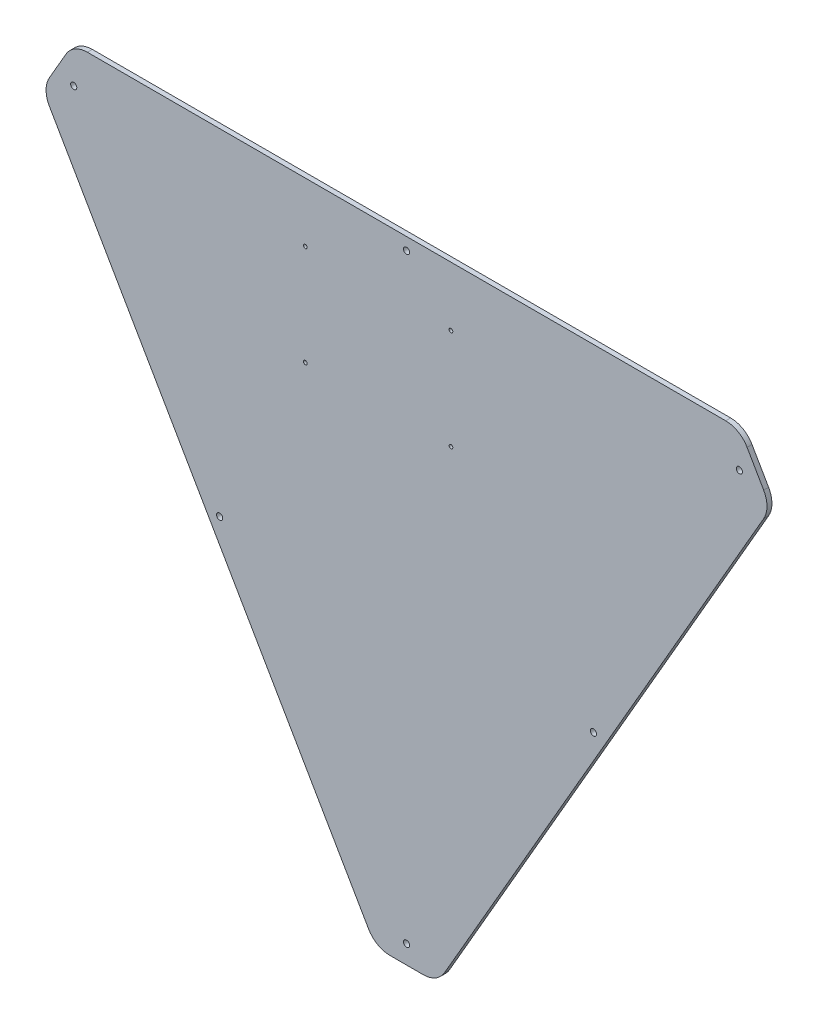
ISO-10303-21;
HEADER;
FILE_DESCRIPTION(('STEP AP214'),'2;1');
FILE_NAME('part.step','',(''),(''),'','','');
FILE_SCHEMA(('AUTOMOTIVE_DESIGN { 1 0 10303 214 1 1 1 1 }'));
ENDSEC;
DATA;
#1=APPLICATION_CONTEXT('core data for automotive mechanical design processes');
#2=APPLICATION_PROTOCOL_DEFINITION('international standard','automotive_design',2000,#1);
#3=PRODUCT_CONTEXT('',#1,'mechanical');
#4=PRODUCT('Part','Part','',(#3));
#5=PRODUCT_RELATED_PRODUCT_CATEGORY('part','',(#4));
#6=PRODUCT_DEFINITION_FORMATION('','',#4);
#7=PRODUCT_DEFINITION_CONTEXT('part definition',#1,'design');
#8=PRODUCT_DEFINITION('design','',#6,#7);
#9=PRODUCT_DEFINITION_SHAPE('','',#8);
#10=(LENGTH_UNIT() NAMED_UNIT(*) SI_UNIT(.MILLI.,.METRE.));
#11=(NAMED_UNIT(*) PLANE_ANGLE_UNIT() SI_UNIT($,.RADIAN.));
#12=(NAMED_UNIT(*) SI_UNIT($,.STERADIAN.) SOLID_ANGLE_UNIT());
#13=UNCERTAINTY_MEASURE_WITH_UNIT(LENGTH_MEASURE(1.E-05),#10,'distance_accuracy_value','');
#14=(GEOMETRIC_REPRESENTATION_CONTEXT(3) GLOBAL_UNCERTAINTY_ASSIGNED_CONTEXT((#13)) GLOBAL_UNIT_ASSIGNED_CONTEXT((#10,
#11,#12)) REPRESENTATION_CONTEXT('',''));
#15=CARTESIAN_POINT('',(0.,0.,0.));
#16=DIRECTION('',(0.,0.,1.));
#17=DIRECTION('',(1.,0.,0.));
#18=AXIS2_PLACEMENT_3D('',#15,#16,#17);
#19=CARTESIAN_POINT('',(306.552641702223,193.342371016313,4.));
#20=DIRECTION('',(0.,0.,1.));
#21=DIRECTION('',(1.,0.,0.));
#22=AXIS2_PLACEMENT_3D('',#19,#20,#21);
#23=PLANE('',#22);
#24=CARTESIAN_POINT('',(70.4393930481637,107.143641205548,4.));
#25=DIRECTION('',(0.,0.,1.));
#26=DIRECTION('',(1.,0.,0.));
#27=AXIS2_PLACEMENT_3D('',#24,#25,#26);
#28=CIRCLE('',#27,1.5);
#29=CARTESIAN_POINT('',(71.9393930481637,107.143641205548,4.));
#30=VERTEX_POINT('',#29);
#31=EDGE_CURVE('E301',#30,#30,#28,.T.);
#32=ORIENTED_EDGE('',*,*,#31,.F.);
#33=EDGE_LOOP('',(#32));
#34=FACE_BOUND('',#33,.T.);
#35=CARTESIAN_POINT('',(-47.5606069518363,188.643641205548,4.));
#36=DIRECTION('',(0.,0.,1.));
#37=DIRECTION('',(-1.,0.,0.));
#38=AXIS2_PLACEMENT_3D('',#35,#36,#37);
#39=CIRCLE('',#38,1.5);
#40=CARTESIAN_POINT('',(-49.0606069518363,188.643641205548,4.));
#41=VERTEX_POINT('',#40);
#42=EDGE_CURVE('E295',#41,#41,#39,.T.);
#43=ORIENTED_EDGE('',*,*,#42,.F.);
#44=EDGE_LOOP('',(#43));
#45=FACE_BOUND('',#44,.T.);
#46=CARTESIAN_POINT('',(70.4393930481637,188.643641205548,4.));
#47=DIRECTION('',(0.,0.,1.));
#48=DIRECTION('',(-1.,0.,0.));
#49=AXIS2_PLACEMENT_3D('',#46,#47,#48);
#50=CIRCLE('',#49,1.5);
#51=CARTESIAN_POINT('',(68.9393930481637,188.643641205548,4.));
#52=VERTEX_POINT('',#51);
#53=EDGE_CURVE('E289',#52,#52,#50,.T.);
#54=ORIENTED_EDGE('',*,*,#53,.F.);
#55=EDGE_LOOP('',(#54));
#56=FACE_BOUND('',#55,.T.);
#57=CARTESIAN_POINT('',(-47.5606069518363,107.143641205548,4.));
#58=DIRECTION('',(0.,0.,1.));
#59=DIRECTION('',(1.,0.,0.));
#60=AXIS2_PLACEMENT_3D('',#57,#58,#59);
#61=CIRCLE('',#60,1.5);
#62=CARTESIAN_POINT('',(-46.0606069518363,107.143641205548,4.));
#63=VERTEX_POINT('',#62);
#64=EDGE_CURVE('E283',#63,#63,#61,.T.);
#65=ORIENTED_EDGE('',*,*,#64,.F.);
#66=EDGE_LOOP('',(#65));
#67=FACE_BOUND('',#66,.T.);
#68=CARTESIAN_POINT('',(-235.277485316707,207.493006110937,4.));
#69=DIRECTION('',(0.,0.,1.));
#70=DIRECTION('',(1.,0.,0.));
#71=AXIS2_PLACEMENT_3D('',#68,#69,#70);
#72=CIRCLE('',#71,2.5);
#73=CARTESIAN_POINT('',(-232.777485316707,207.493006110937,4.));
#74=VERTEX_POINT('',#73);
#75=EDGE_CURVE('E278',#74,#74,#72,.T.);
#76=ORIENTED_EDGE('',*,*,#75,.F.);
#77=EDGE_LOOP('',(#76));
#78=FACE_BOUND('',#77,.T.);
#79=CARTESIAN_POINT('',(304.156271413035,207.493006110921,4.));
#80=DIRECTION('',(0.,0.,1.));
#81=DIRECTION('',(1.,0.,0.));
#82=AXIS2_PLACEMENT_3D('',#79,#80,#81);
#83=CIRCLE('',#82,2.50000000000002);
#84=CARTESIAN_POINT('',(306.656271413035,207.493006110921,4.));
#85=VERTEX_POINT('',#84);
#86=EDGE_CURVE('E272',#85,#85,#83,.T.);
#87=ORIENTED_EDGE('',*,*,#86,.F.);
#88=EDGE_LOOP('',(#87));
#89=FACE_BOUND('',#88,.T.);
#90=CARTESIAN_POINT('',(34.4393930481654,-259.67033087591,4.));
#91=DIRECTION('',(0.,0.,1.));
#92=DIRECTION('',(1.,0.,0.));
#93=AXIS2_PLACEMENT_3D('',#90,#91,#92);
#94=CIRCLE('',#93,2.5);
#95=CARTESIAN_POINT('',(36.9393930481654,-259.67033087591,4.));
#96=VERTEX_POINT('',#95);
#97=EDGE_CURVE('E266',#96,#96,#94,.T.);
#98=ORIENTED_EDGE('',*,*,#97,.F.);
#99=EDGE_LOOP('',(#98));
#100=FACE_BOUND('',#99,.T.);
#101=CARTESIAN_POINT('',(185.882768721146,-35.6639799297911,4.));
#102=DIRECTION('',(0.,0.,1.));
#103=DIRECTION('',(1.,0.,0.));
#104=AXIS2_PLACEMENT_3D('',#101,#102,#103);
#105=CIRCLE('',#104,2.5);
#106=CARTESIAN_POINT('',(188.382768721146,-35.6639799297911,4.));
#107=VERTEX_POINT('',#106);
#108=EDGE_CURVE('E260',#107,#107,#105,.T.);
#109=ORIENTED_EDGE('',*,*,#108,.F.);
#110=EDGE_LOOP('',(#109));
#111=FACE_BOUND('',#110,.T.);
#112=CARTESIAN_POINT('',(-117.003982624812,-35.6639799297933,4.));
#113=DIRECTION('',(0.,0.,1.));
#114=DIRECTION('',(1.,0.,0.));
#115=AXIS2_PLACEMENT_3D('',#112,#113,#114);
#116=CIRCLE('',#115,2.5);
#117=CARTESIAN_POINT('',(-114.503982624812,-35.6639799297933,4.));
#118=VERTEX_POINT('',#117);
#119=EDGE_CURVE('E253',#118,#118,#116,.T.);
#120=ORIENTED_EDGE('',*,*,#119,.F.);
#121=EDGE_LOOP('',(#120));
#122=FACE_BOUND('',#121,.T.);
#123=CARTESIAN_POINT('',(34.439393048171,226.643641205547,4.));
#124=DIRECTION('',(0.,0.,1.));
#125=DIRECTION('',(1.,0.,0.));
#126=AXIS2_PLACEMENT_3D('',#123,#124,#125);
#127=CIRCLE('',#126,2.49999999999314);
#128=CARTESIAN_POINT('',(36.9393930481641,226.643641205547,4.));
#129=VERTEX_POINT('',#128);
#130=EDGE_CURVE('E247',#129,#129,#127,.T.);
#131=ORIENTED_EDGE('',*,*,#130,.F.);
#132=EDGE_LOOP('',(#131));
#133=FACE_BOUND('',#132,.T.);
#134=DIRECTION('',(0.5,0.866025403784439,0.));
#135=VECTOR('',#134,1.);
#136=CARTESIAN_POINT('',(69.5430227589896,-257.170330875906,4.));
#137=LINE('',#136,#135);
#138=CARTESIAN_POINT('',(65.2128957400673,-264.670330875907,4.));
#139=VERTEX_POINT('',#138);
#140=CARTESIAN_POINT('',(323.873149777912,183.342371016313,4.));
#141=VERTEX_POINT('',#140);
#142=EDGE_CURVE('E50',#139,#141,#137,.T.);
#143=ORIENTED_EDGE('',*,*,#142,.T.);
#144=CARTESIAN_POINT('',(306.552641702223,193.342371016313,4.));
#145=DIRECTION('',(0.,0.,1.));
#146=DIRECTION('',(1.,0.,0.));
#147=AXIS2_PLACEMENT_3D('',#144,#145,#146);
#148=CIRCLE('',#147,20.);
#149=CARTESIAN_POINT('',(323.873149777905,203.342371016326,4.));
#150=VERTEX_POINT('',#149);
#151=EDGE_CURVE('E243',#141,#150,#148,.T.);
#152=ORIENTED_EDGE('',*,*,#151,.T.);
#153=DIRECTION('',(-0.500000000000001,0.866025403784438,0.));
#154=VECTOR('',#153,1.);
#155=CARTESIAN_POINT('',(310.420155161697,226.643641205548,4.));
#156=LINE('',#155,#154);
#157=CARTESIAN_POINT('',(310.420155161697,226.643641205548,4.));
#158=VERTEX_POINT('',#157);
#159=EDGE_CURVE('E204',#150,#158,#156,.T.);
#160=ORIENTED_EDGE('',*,*,#159,.T.);
#161=CARTESIAN_POINT('',(293.099647086009,216.643641205547,4.));
#162=DIRECTION('',(0.,0.,1.));
#163=DIRECTION('',(1.,0.,0.));
#164=AXIS2_PLACEMENT_3D('',#161,#162,#163);
#165=CIRCLE('',#164,20.);
#166=CARTESIAN_POINT('',(293.099647086009,236.643641205547,4.));
#167=VERTEX_POINT('',#166);
#168=EDGE_CURVE('E224',#158,#167,#165,.T.);
#169=ORIENTED_EDGE('',*,*,#168,.T.);
#170=DIRECTION('',(-1.,0.,0.));
#171=VECTOR('',#170,1.);
#172=CARTESIAN_POINT('',(284.439393048164,236.643641205547,4.));
#173=LINE('',#172,#171);
#174=CARTESIAN_POINT('',(-224.220860989681,236.643641205548,4.));
#175=VERTEX_POINT('',#174);
#176=EDGE_CURVE('E221',#167,#175,#173,.T.);
#177=ORIENTED_EDGE('',*,*,#176,.T.);
#178=CARTESIAN_POINT('',(-224.220860989681,216.643641205548,4.));
#179=DIRECTION('',(0.,0.,1.));
#180=DIRECTION('',(1.,0.,0.));
#181=AXIS2_PLACEMENT_3D('',#178,#179,#180);
#182=CIRCLE('',#181,20.);
#183=CARTESIAN_POINT('',(-241.54136906537,226.643641205547,4.));
#184=VERTEX_POINT('',#183);
#185=EDGE_CURVE('E223',#175,#184,#182,.T.);
#186=ORIENTED_EDGE('',*,*,#185,.T.);
#187=DIRECTION('',(-0.499999999999993,-0.866025403784443,0.));
#188=VECTOR('',#187,1.);
#189=CARTESIAN_POINT('',(-254.994363681577,203.342371016325,4.));
#190=LINE('',#189,#188);
#191=CARTESIAN_POINT('',(-254.994363681577,203.342371016325,4.));
#192=VERTEX_POINT('',#191);
#193=EDGE_CURVE('E226',#184,#192,#190,.T.);
#194=ORIENTED_EDGE('',*,*,#193,.T.);
#195=CARTESIAN_POINT('',(-237.673855605888,193.342371016326,4.));
#196=DIRECTION('',(0.,0.,1.));
#197=DIRECTION('',(1.,0.,0.));
#198=AXIS2_PLACEMENT_3D('',#195,#196,#197);
#199=CIRCLE('',#198,20.);
#200=CARTESIAN_POINT('',(-254.994363681577,183.342371016325,4.));
#201=VERTEX_POINT('',#200);
#202=EDGE_CURVE('E232',#192,#201,#199,.T.);
#203=ORIENTED_EDGE('',*,*,#202,.T.);
#204=DIRECTION('',(0.500000000000013,-0.866025403784431,0.));
#205=VECTOR('',#204,1.);
#206=CARTESIAN_POINT('',(-250.664236662655,175.842371016325,4.));
#207=LINE('',#206,#205);
#208=CARTESIAN_POINT('',(3.66589035627478,-264.670330875907,4.));
#209=VERTEX_POINT('',#208);
#210=EDGE_CURVE('E133',#201,#209,#207,.T.);
#211=ORIENTED_EDGE('',*,*,#210,.T.);
#212=CARTESIAN_POINT('',(20.9863984319636,-254.670330875907,4.));
#213=DIRECTION('',(0.,0.,1.));
#214=DIRECTION('',(1.,0.,0.));
#215=AXIS2_PLACEMENT_3D('',#212,#213,#214);
#216=CIRCLE('',#215,20.);
#217=CARTESIAN_POINT('',(20.9863984319636,-274.670330875907,4.));
#218=VERTEX_POINT('',#217);
#219=EDGE_CURVE('E128',#209,#218,#216,.T.);
#220=ORIENTED_EDGE('',*,*,#219,.T.);
#221=DIRECTION('',(1.,0.,0.));
#222=VECTOR('',#221,1.);
#223=CARTESIAN_POINT('',(47.8923876643785,-274.670330875907,4.));
#224=LINE('',#223,#222);
#225=CARTESIAN_POINT('',(47.8923876643785,-274.670330875907,4.));
#226=VERTEX_POINT('',#225);
#227=EDGE_CURVE('E131',#218,#226,#224,.T.);
#228=ORIENTED_EDGE('',*,*,#227,.T.);
#229=CARTESIAN_POINT('',(47.8923876643785,-254.670330875907,4.));
#230=DIRECTION('',(0.,0.,1.));
#231=DIRECTION('',(1.,0.,0.));
#232=AXIS2_PLACEMENT_3D('',#229,#230,#231);
#233=CIRCLE('',#232,20.);
#234=EDGE_CURVE('E147',#226,#139,#233,.T.);
#235=ORIENTED_EDGE('',*,*,#234,.T.);
#236=EDGE_LOOP('',(#143,#152,#160,#169,#177,#186,#194,#203,#211,#220,#228,#235));
#237=FACE_BOUND('',#236,.T.);
#238=ADVANCED_FACE('F33',(#34,#45,#56,#67,#78,#89,#100,#111,#122,#133,#237),#23,.T.);
#239=CARTESIAN_POINT('',(306.552641702223,193.342371016313,0.));
#240=DIRECTION('',(0.,0.,1.));
#241=DIRECTION('',(1.,0.,0.));
#242=AXIS2_PLACEMENT_3D('',#239,#240,#241);
#243=PLANE('',#242);
#244=CARTESIAN_POINT('',(70.4393930481637,107.143641205548,0.));
#245=DIRECTION('',(0.,0.,1.));
#246=DIRECTION('',(1.,0.,0.));
#247=AXIS2_PLACEMENT_3D('',#244,#245,#246);
#248=CIRCLE('',#247,1.5);
#249=CARTESIAN_POINT('',(71.9393930481637,107.143641205548,0.));
#250=VERTEX_POINT('',#249);
#251=EDGE_CURVE('E286',#250,#250,#248,.T.);
#252=ORIENTED_EDGE('',*,*,#251,.T.);
#253=EDGE_LOOP('',(#252));
#254=FACE_BOUND('',#253,.T.);
#255=CARTESIAN_POINT('',(-47.5606069518363,188.643641205548,0.));
#256=DIRECTION('',(0.,0.,1.));
#257=DIRECTION('',(-1.,0.,0.));
#258=AXIS2_PLACEMENT_3D('',#255,#256,#257);
#259=CIRCLE('',#258,1.5);
#260=CARTESIAN_POINT('',(-49.0606069518363,188.643641205548,0.));
#261=VERTEX_POINT('',#260);
#262=EDGE_CURVE('E298',#261,#261,#259,.T.);
#263=ORIENTED_EDGE('',*,*,#262,.T.);
#264=EDGE_LOOP('',(#263));
#265=FACE_BOUND('',#264,.T.);
#266=CARTESIAN_POINT('',(70.4393930481637,188.643641205548,0.));
#267=DIRECTION('',(0.,0.,1.));
#268=DIRECTION('',(-1.,0.,0.));
#269=AXIS2_PLACEMENT_3D('',#266,#267,#268);
#270=CIRCLE('',#269,1.5);
#271=CARTESIAN_POINT('',(68.9393930481637,188.643641205548,0.));
#272=VERTEX_POINT('',#271);
#273=EDGE_CURVE('E292',#272,#272,#270,.T.);
#274=ORIENTED_EDGE('',*,*,#273,.T.);
#275=EDGE_LOOP('',(#274));
#276=FACE_BOUND('',#275,.T.);
#277=CARTESIAN_POINT('',(-47.5606069518363,107.143641205548,0.));
#278=DIRECTION('',(0.,0.,1.));
#279=DIRECTION('',(1.,0.,0.));
#280=AXIS2_PLACEMENT_3D('',#277,#278,#279);
#281=CIRCLE('',#280,1.5);
#282=CARTESIAN_POINT('',(-46.0606069518363,107.143641205548,0.));
#283=VERTEX_POINT('',#282);
#284=EDGE_CURVE('E257',#283,#283,#281,.T.);
#285=ORIENTED_EDGE('',*,*,#284,.T.);
#286=EDGE_LOOP('',(#285));
#287=FACE_BOUND('',#286,.T.);
#288=CARTESIAN_POINT('',(-235.277485316707,207.493006110937,0.));
#289=DIRECTION('',(0.,0.,1.));
#290=DIRECTION('',(1.,0.,0.));
#291=AXIS2_PLACEMENT_3D('',#288,#289,#290);
#292=CIRCLE('',#291,2.5);
#293=CARTESIAN_POINT('',(-232.777485316707,207.493006110937,0.));
#294=VERTEX_POINT('',#293);
#295=EDGE_CURVE('E250',#294,#294,#292,.T.);
#296=ORIENTED_EDGE('',*,*,#295,.T.);
#297=EDGE_LOOP('',(#296));
#298=FACE_BOUND('',#297,.T.);
#299=CARTESIAN_POINT('',(304.156271413035,207.493006110921,0.));
#300=DIRECTION('',(0.,0.,1.));
#301=DIRECTION('',(1.,0.,0.));
#302=AXIS2_PLACEMENT_3D('',#299,#300,#301);
#303=CIRCLE('',#302,2.50000000000002);
#304=CARTESIAN_POINT('',(306.656271413035,207.493006110921,0.));
#305=VERTEX_POINT('',#304);
#306=EDGE_CURVE('E275',#305,#305,#303,.T.);
#307=ORIENTED_EDGE('',*,*,#306,.T.);
#308=EDGE_LOOP('',(#307));
#309=FACE_BOUND('',#308,.T.);
#310=CARTESIAN_POINT('',(34.4393930481654,-259.67033087591,0.));
#311=DIRECTION('',(0.,0.,1.));
#312=DIRECTION('',(1.,0.,0.));
#313=AXIS2_PLACEMENT_3D('',#310,#311,#312);
#314=CIRCLE('',#313,2.5);
#315=CARTESIAN_POINT('',(36.9393930481654,-259.67033087591,0.));
#316=VERTEX_POINT('',#315);
#317=EDGE_CURVE('E269',#316,#316,#314,.T.);
#318=ORIENTED_EDGE('',*,*,#317,.T.);
#319=EDGE_LOOP('',(#318));
#320=FACE_BOUND('',#319,.T.);
#321=CARTESIAN_POINT('',(185.882768721146,-35.6639799297911,0.));
#322=DIRECTION('',(0.,0.,1.));
#323=DIRECTION('',(1.,0.,0.));
#324=AXIS2_PLACEMENT_3D('',#321,#322,#323);
#325=CIRCLE('',#324,2.5);
#326=CARTESIAN_POINT('',(188.382768721146,-35.6639799297911,0.));
#327=VERTEX_POINT('',#326);
#328=EDGE_CURVE('E263',#327,#327,#325,.T.);
#329=ORIENTED_EDGE('',*,*,#328,.T.);
#330=EDGE_LOOP('',(#329));
#331=FACE_BOUND('',#330,.T.);
#332=CARTESIAN_POINT('',(-117.003982624812,-35.6639799297933,0.));
#333=DIRECTION('',(0.,0.,1.));
#334=DIRECTION('',(1.,0.,0.));
#335=AXIS2_PLACEMENT_3D('',#332,#333,#334);
#336=CIRCLE('',#335,2.5);
#337=CARTESIAN_POINT('',(-114.503982624812,-35.6639799297933,0.));
#338=VERTEX_POINT('',#337);
#339=EDGE_CURVE('E256',#338,#338,#336,.T.);
#340=ORIENTED_EDGE('',*,*,#339,.T.);
#341=EDGE_LOOP('',(#340));
#342=FACE_BOUND('',#341,.T.);
#343=CARTESIAN_POINT('',(34.439393048171,226.643641205547,0.));
#344=DIRECTION('',(0.,0.,1.));
#345=DIRECTION('',(1.,0.,0.));
#346=AXIS2_PLACEMENT_3D('',#343,#344,#345);
#347=CIRCLE('',#346,2.49999999999314);
#348=CARTESIAN_POINT('',(36.9393930481641,226.643641205547,0.));
#349=VERTEX_POINT('',#348);
#350=EDGE_CURVE('E156',#349,#349,#347,.T.);
#351=ORIENTED_EDGE('',*,*,#350,.T.);
#352=EDGE_LOOP('',(#351));
#353=FACE_BOUND('',#352,.T.);
#354=CARTESIAN_POINT('',(306.552641702223,193.342371016313,0.));
#355=DIRECTION('',(0.,0.,1.));
#356=DIRECTION('',(1.,0.,0.));
#357=AXIS2_PLACEMENT_3D('',#354,#355,#356);
#358=CIRCLE('',#357,20.);
#359=CARTESIAN_POINT('',(323.873149777912,183.342371016313,0.));
#360=VERTEX_POINT('',#359);
#361=CARTESIAN_POINT('',(323.873149777905,203.342371016326,0.));
#362=VERTEX_POINT('',#361);
#363=EDGE_CURVE('E153',#360,#362,#358,.T.);
#364=ORIENTED_EDGE('',*,*,#363,.F.);
#365=DIRECTION('',(0.499999999999999,0.866025403784439,0.));
#366=VECTOR('',#365,1.);
#367=CARTESIAN_POINT('',(69.5430227589896,-257.170330875906,0.));
#368=LINE('',#367,#366);
#369=CARTESIAN_POINT('',(65.2128957400673,-264.670330875907,0.));
#370=VERTEX_POINT('',#369);
#371=EDGE_CURVE('E175',#370,#360,#368,.T.);
#372=ORIENTED_EDGE('',*,*,#371,.F.);
#373=CARTESIAN_POINT('',(47.8923876643785,-254.670330875907,0.));
#374=DIRECTION('',(0.,0.,1.));
#375=DIRECTION('',(1.,0.,0.));
#376=AXIS2_PLACEMENT_3D('',#373,#374,#375);
#377=CIRCLE('',#376,20.);
#378=CARTESIAN_POINT('',(47.8923876643785,-274.670330875907,0.));
#379=VERTEX_POINT('',#378);
#380=EDGE_CURVE('E99',#379,#370,#377,.T.);
#381=ORIENTED_EDGE('',*,*,#380,.F.);
#382=DIRECTION('',(1.,0.,0.));
#383=VECTOR('',#382,1.);
#384=CARTESIAN_POINT('',(47.8923876643785,-274.670330875907,0.));
#385=LINE('',#384,#383);
#386=CARTESIAN_POINT('',(20.9863984319636,-274.670330875907,0.));
#387=VERTEX_POINT('',#386);
#388=EDGE_CURVE('E92',#387,#379,#385,.T.);
#389=ORIENTED_EDGE('',*,*,#388,.F.);
#390=CARTESIAN_POINT('',(20.9863984319636,-254.670330875907,0.));
#391=DIRECTION('',(0.,0.,1.));
#392=DIRECTION('',(1.,0.,0.));
#393=AXIS2_PLACEMENT_3D('',#390,#391,#392);
#394=CIRCLE('',#393,20.);
#395=CARTESIAN_POINT('',(3.66589035627478,-264.670330875907,0.));
#396=VERTEX_POINT('',#395);
#397=EDGE_CURVE('E141',#396,#387,#394,.T.);
#398=ORIENTED_EDGE('',*,*,#397,.F.);
#399=DIRECTION('',(0.500000000000644,-0.866025403784067,0.));
#400=VECTOR('',#399,1.);
#401=CARTESIAN_POINT('',(3.66589035627478,-264.670330875907,0.));
#402=LINE('',#401,#400);
#403=CARTESIAN_POINT('',(-254.994363681577,183.342371016325,0.));
#404=VERTEX_POINT('',#403);
#405=EDGE_CURVE('E170',#404,#396,#402,.T.);
#406=ORIENTED_EDGE('',*,*,#405,.F.);
#407=CARTESIAN_POINT('',(-237.673855605888,193.342371016326,0.));
#408=DIRECTION('',(0.,0.,1.));
#409=DIRECTION('',(1.,0.,0.));
#410=AXIS2_PLACEMENT_3D('',#407,#408,#409);
#411=CIRCLE('',#410,20.);
#412=CARTESIAN_POINT('',(-254.994363681577,203.342371016325,0.));
#413=VERTEX_POINT('',#412);
#414=EDGE_CURVE('E167',#413,#404,#411,.T.);
#415=ORIENTED_EDGE('',*,*,#414,.F.);
#416=DIRECTION('',(-0.499999999999993,-0.866025403784443,0.));
#417=VECTOR('',#416,1.);
#418=CARTESIAN_POINT('',(-254.994363681577,203.342371016325,0.));
#419=LINE('',#418,#417);
#420=CARTESIAN_POINT('',(-241.54136906537,226.643641205547,0.));
#421=VERTEX_POINT('',#420);
#422=EDGE_CURVE('E165',#421,#413,#419,.T.);
#423=ORIENTED_EDGE('',*,*,#422,.F.);
#424=CARTESIAN_POINT('',(-224.220860989681,216.643641205548,0.));
#425=DIRECTION('',(0.,0.,1.));
#426=DIRECTION('',(1.,0.,0.));
#427=AXIS2_PLACEMENT_3D('',#424,#425,#426);
#428=CIRCLE('',#427,20.);
#429=CARTESIAN_POINT('',(-224.220860989681,236.643641205548,0.));
#430=VERTEX_POINT('',#429);
#431=EDGE_CURVE('E163',#430,#421,#428,.T.);
#432=ORIENTED_EDGE('',*,*,#431,.F.);
#433=DIRECTION('',(-1.,0.,0.));
#434=VECTOR('',#433,1.);
#435=CARTESIAN_POINT('',(-224.220860989681,236.643641205548,0.));
#436=LINE('',#435,#434);
#437=CARTESIAN_POINT('',(293.099647086009,236.643641205547,0.));
#438=VERTEX_POINT('',#437);
#439=EDGE_CURVE('E161',#438,#430,#436,.T.);
#440=ORIENTED_EDGE('',*,*,#439,.F.);
#441=CARTESIAN_POINT('',(293.099647086009,216.643641205547,0.));
#442=DIRECTION('',(0.,0.,1.));
#443=DIRECTION('',(1.,0.,0.));
#444=AXIS2_PLACEMENT_3D('',#441,#442,#443);
#445=CIRCLE('',#444,20.);
#446=CARTESIAN_POINT('',(310.420155161697,226.643641205548,0.));
#447=VERTEX_POINT('',#446);
#448=EDGE_CURVE('E158',#447,#438,#445,.T.);
#449=ORIENTED_EDGE('',*,*,#448,.F.);
#450=DIRECTION('',(-0.500000000000001,0.866025403784438,0.));
#451=VECTOR('',#450,1.);
#452=CARTESIAN_POINT('',(310.420155161697,226.643641205548,0.));
#453=LINE('',#452,#451);
#454=EDGE_CURVE('E155',#362,#447,#453,.T.);
#455=ORIENTED_EDGE('',*,*,#454,.F.);
#456=EDGE_LOOP('',(#364,#372,#381,#389,#398,#406,#415,#423,#432,#440,#449,#455));
#457=FACE_BOUND('',#456,.T.);
#458=ADVANCED_FACE('F210',(#254,#265,#276,#287,#298,#309,#320,#331,#342,#353,#457),#243,.F.);
#459=CARTESIAN_POINT('',(306.552641702223,193.342371016313,4.));
#460=DIRECTION('',(0.,0.,-1.));
#461=DIRECTION('',(-1.,0.,0.));
#462=AXIS2_PLACEMENT_3D('',#459,#460,#461);
#463=CYLINDRICAL_SURFACE('',#462,20.);
#464=ORIENTED_EDGE('',*,*,#363,.T.);
#465=DIRECTION('',(0.,0.,-1.));
#466=VECTOR('',#465,1.);
#467=CARTESIAN_POINT('',(323.873149777905,203.342371016326,4.));
#468=LINE('',#467,#466);
#469=EDGE_CURVE('E42',#150,#362,#468,.T.);
#470=ORIENTED_EDGE('',*,*,#469,.F.);
#471=ORIENTED_EDGE('',*,*,#151,.F.);
#472=DIRECTION('',(0.,0.,-1.));
#473=VECTOR('',#472,1.);
#474=CARTESIAN_POINT('',(323.873149777912,183.342371016313,4.));
#475=LINE('',#474,#473);
#476=EDGE_CURVE('E11',#141,#360,#475,.T.);
#477=ORIENTED_EDGE('',*,*,#476,.T.);
#478=EDGE_LOOP('',(#464,#470,#471,#477));
#479=FACE_BOUND('',#478,.T.);
#480=ADVANCED_FACE('F35',(#479),#463,.T.);
#481=CARTESIAN_POINT('',(310.420155161697,226.643641205548,4.));
#482=DIRECTION('',(-0.866025403784438,-0.500000000000001,0.));
#483=DIRECTION('',(0.500000000000001,-0.866025403784438,0.));
#484=AXIS2_PLACEMENT_3D('',#481,#482,#483);
#485=PLANE('',#484);
#486=ORIENTED_EDGE('',*,*,#454,.T.);
#487=DIRECTION('',(0.,0.,-1.));
#488=VECTOR('',#487,1.);
#489=CARTESIAN_POINT('',(310.420155161697,226.643641205548,4.));
#490=LINE('',#489,#488);
#491=EDGE_CURVE('E195',#158,#447,#490,.T.);
#492=ORIENTED_EDGE('',*,*,#491,.F.);
#493=ORIENTED_EDGE('',*,*,#159,.F.);
#494=ORIENTED_EDGE('',*,*,#469,.T.);
#495=EDGE_LOOP('',(#486,#492,#493,#494));
#496=FACE_BOUND('',#495,.T.);
#497=ADVANCED_FACE('F202',(#496),#485,.F.);
#498=CARTESIAN_POINT('',(293.099647086009,216.643641205547,4.));
#499=DIRECTION('',(0.,0.,-1.));
#500=DIRECTION('',(-1.,0.,0.));
#501=AXIS2_PLACEMENT_3D('',#498,#499,#500);
#502=CYLINDRICAL_SURFACE('',#501,20.);
#503=ORIENTED_EDGE('',*,*,#448,.T.);
#504=DIRECTION('',(0.,0.,-1.));
#505=VECTOR('',#504,1.);
#506=CARTESIAN_POINT('',(293.099647086009,236.643641205547,4.));
#507=LINE('',#506,#505);
#508=EDGE_CURVE('E192',#167,#438,#507,.T.);
#509=ORIENTED_EDGE('',*,*,#508,.F.);
#510=ORIENTED_EDGE('',*,*,#168,.F.);
#511=ORIENTED_EDGE('',*,*,#491,.T.);
#512=EDGE_LOOP('',(#503,#509,#510,#511));
#513=FACE_BOUND('',#512,.T.);
#514=ADVANCED_FACE('F215',(#513),#502,.T.);
#515=CARTESIAN_POINT('',(-224.220860989681,236.643641205548,4.));
#516=DIRECTION('',(0.,-1.,0.));
#517=DIRECTION('',(1.,0.,0.));
#518=AXIS2_PLACEMENT_3D('',#515,#516,#517);
#519=PLANE('',#518);
#520=ORIENTED_EDGE('',*,*,#439,.T.);
#521=DIRECTION('',(0.,0.,-1.));
#522=VECTOR('',#521,1.);
#523=CARTESIAN_POINT('',(-224.220860989681,236.643641205548,4.));
#524=LINE('',#523,#522);
#525=EDGE_CURVE('E189',#175,#430,#524,.T.);
#526=ORIENTED_EDGE('',*,*,#525,.F.);
#527=ORIENTED_EDGE('',*,*,#176,.F.);
#528=ORIENTED_EDGE('',*,*,#508,.T.);
#529=EDGE_LOOP('',(#520,#526,#527,#528));
#530=FACE_BOUND('',#529,.T.);
#531=ADVANCED_FACE('F219',(#530),#519,.F.);
#532=CARTESIAN_POINT('',(-224.220860989681,216.643641205548,4.));
#533=DIRECTION('',(0.,0.,-1.));
#534=DIRECTION('',(-1.,0.,0.));
#535=AXIS2_PLACEMENT_3D('',#532,#533,#534);
#536=CYLINDRICAL_SURFACE('',#535,20.);
#537=ORIENTED_EDGE('',*,*,#431,.T.);
#538=DIRECTION('',(0.,0.,-1.));
#539=VECTOR('',#538,1.);
#540=CARTESIAN_POINT('',(-241.54136906537,226.643641205547,4.));
#541=LINE('',#540,#539);
#542=EDGE_CURVE('E186',#184,#421,#541,.T.);
#543=ORIENTED_EDGE('',*,*,#542,.F.);
#544=ORIENTED_EDGE('',*,*,#185,.F.);
#545=ORIENTED_EDGE('',*,*,#525,.T.);
#546=EDGE_LOOP('',(#537,#543,#544,#545));
#547=FACE_BOUND('',#546,.T.);
#548=ADVANCED_FACE('F369',(#547),#536,.T.);
#549=CARTESIAN_POINT('',(-254.994363681577,203.342371016325,4.));
#550=DIRECTION('',(0.866025403784443,-0.499999999999993,0.));
#551=DIRECTION('',(0.499999999999993,0.866025403784443,0.));
#552=AXIS2_PLACEMENT_3D('',#549,#550,#551);
#553=PLANE('',#552);
#554=ORIENTED_EDGE('',*,*,#422,.T.);
#555=DIRECTION('',(0.,0.,-1.));
#556=VECTOR('',#555,1.);
#557=CARTESIAN_POINT('',(-254.994363681577,203.342371016325,4.));
#558=LINE('',#557,#556);
#559=EDGE_CURVE('E183',#192,#413,#558,.T.);
#560=ORIENTED_EDGE('',*,*,#559,.F.);
#561=ORIENTED_EDGE('',*,*,#193,.F.);
#562=ORIENTED_EDGE('',*,*,#542,.T.);
#563=EDGE_LOOP('',(#554,#560,#561,#562));
#564=FACE_BOUND('',#563,.T.);
#565=ADVANCED_FACE('F366',(#564),#553,.F.);
#566=CARTESIAN_POINT('',(-237.673855605888,193.342371016326,4.));
#567=DIRECTION('',(0.,0.,-1.));
#568=DIRECTION('',(-1.,0.,0.));
#569=AXIS2_PLACEMENT_3D('',#566,#567,#568);
#570=CYLINDRICAL_SURFACE('',#569,20.);
#571=ORIENTED_EDGE('',*,*,#414,.T.);
#572=DIRECTION('',(0.,0.,-1.));
#573=VECTOR('',#572,1.);
#574=CARTESIAN_POINT('',(-254.994363681577,183.342371016325,4.));
#575=LINE('',#574,#573);
#576=EDGE_CURVE('E180',#201,#404,#575,.T.);
#577=ORIENTED_EDGE('',*,*,#576,.F.);
#578=ORIENTED_EDGE('',*,*,#202,.F.);
#579=ORIENTED_EDGE('',*,*,#559,.T.);
#580=EDGE_LOOP('',(#571,#577,#578,#579));
#581=FACE_BOUND('',#580,.T.);
#582=ADVANCED_FACE('F238',(#581),#570,.T.);
#583=CARTESIAN_POINT('',(3.66589035627478,-264.670330875907,4.));
#584=DIRECTION('',(0.866025403784067,0.500000000000644,0.));
#585=DIRECTION('',(-0.500000000000644,0.866025403784067,0.));
#586=AXIS2_PLACEMENT_3D('',#583,#584,#585);
#587=PLANE('',#586);
#588=ORIENTED_EDGE('',*,*,#405,.T.);
#589=DIRECTION('',(0.,0.,-1.));
#590=VECTOR('',#589,1.);
#591=CARTESIAN_POINT('',(3.66589035627478,-264.670330875907,4.));
#592=LINE('',#591,#590);
#593=EDGE_CURVE('E142',#209,#396,#592,.T.);
#594=ORIENTED_EDGE('',*,*,#593,.F.);
#595=ORIENTED_EDGE('',*,*,#210,.F.);
#596=ORIENTED_EDGE('',*,*,#576,.T.);
#597=EDGE_LOOP('',(#588,#594,#595,#596));
#598=FACE_BOUND('',#597,.T.);
#599=ADVANCED_FACE('F241',(#598),#587,.F.);
#600=CARTESIAN_POINT('',(20.9863984319636,-254.670330875907,4.));
#601=DIRECTION('',(0.,0.,-1.));
#602=DIRECTION('',(-1.,0.,0.));
#603=AXIS2_PLACEMENT_3D('',#600,#601,#602);
#604=CYLINDRICAL_SURFACE('',#603,20.);
#605=ORIENTED_EDGE('',*,*,#397,.T.);
#606=DIRECTION('',(0.,0.,-1.));
#607=VECTOR('',#606,1.);
#608=CARTESIAN_POINT('',(20.9863984319636,-274.670330875907,4.));
#609=LINE('',#608,#607);
#610=EDGE_CURVE('E138',#218,#387,#609,.T.);
#611=ORIENTED_EDGE('',*,*,#610,.F.);
#612=ORIENTED_EDGE('',*,*,#219,.F.);
#613=ORIENTED_EDGE('',*,*,#593,.T.);
#614=EDGE_LOOP('',(#605,#611,#612,#613));
#615=FACE_BOUND('',#614,.T.);
#616=ADVANCED_FACE('F139',(#615),#604,.T.);
#617=CARTESIAN_POINT('',(47.8923876643785,-274.670330875907,4.));
#618=DIRECTION('',(0.,1.,0.));
#619=DIRECTION('',(0.,0.,1.));
#620=AXIS2_PLACEMENT_3D('',#617,#618,#619);
#621=PLANE('',#620);
#622=ORIENTED_EDGE('',*,*,#388,.T.);
#623=DIRECTION('',(0.,0.,-1.));
#624=VECTOR('',#623,1.);
#625=CARTESIAN_POINT('',(47.8923876643785,-274.670330875907,4.));
#626=LINE('',#625,#624);
#627=EDGE_CURVE('E143',#226,#379,#626,.T.);
#628=ORIENTED_EDGE('',*,*,#627,.F.);
#629=ORIENTED_EDGE('',*,*,#227,.F.);
#630=ORIENTED_EDGE('',*,*,#610,.T.);
#631=EDGE_LOOP('',(#622,#628,#629,#630));
#632=FACE_BOUND('',#631,.T.);
#633=ADVANCED_FACE('F145',(#632),#621,.F.);
#634=CARTESIAN_POINT('',(47.8923876643785,-254.670330875907,4.));
#635=DIRECTION('',(0.,0.,-1.));
#636=DIRECTION('',(-1.,0.,0.));
#637=AXIS2_PLACEMENT_3D('',#634,#635,#636);
#638=CYLINDRICAL_SURFACE('',#637,20.);
#639=ORIENTED_EDGE('',*,*,#380,.T.);
#640=DIRECTION('',(0.,0.,-1.));
#641=VECTOR('',#640,1.);
#642=CARTESIAN_POINT('',(65.2128957400673,-264.670330875907,4.));
#643=LINE('',#642,#641);
#644=EDGE_CURVE('E149',#139,#370,#643,.T.);
#645=ORIENTED_EDGE('',*,*,#644,.F.);
#646=ORIENTED_EDGE('',*,*,#234,.F.);
#647=ORIENTED_EDGE('',*,*,#627,.T.);
#648=EDGE_LOOP('',(#639,#645,#646,#647));
#649=FACE_BOUND('',#648,.T.);
#650=ADVANCED_FACE('F349',(#649),#638,.T.);
#651=CARTESIAN_POINT('',(69.5430227589896,-257.170330875906,4.));
#652=DIRECTION('',(-0.866025403784439,0.499999999999999,0.));
#653=DIRECTION('',(-0.499999999999999,-0.866025403784439,0.));
#654=AXIS2_PLACEMENT_3D('',#651,#652,#653);
#655=PLANE('',#654);
#656=ORIENTED_EDGE('',*,*,#371,.T.);
#657=ORIENTED_EDGE('',*,*,#476,.F.);
#658=ORIENTED_EDGE('',*,*,#142,.F.);
#659=ORIENTED_EDGE('',*,*,#644,.T.);
#660=EDGE_LOOP('',(#656,#657,#658,#659));
#661=FACE_BOUND('',#660,.T.);
#662=ADVANCED_FACE('F242',(#661),#655,.F.);
#663=CARTESIAN_POINT('',(34.439393048171,226.643641205547,0.));
#664=DIRECTION('',(0.,0.,1.));
#665=DIRECTION('',(1.,0.,0.));
#666=AXIS2_PLACEMENT_3D('',#663,#664,#665);
#667=CYLINDRICAL_SURFACE('',#666,2.49999999999314);
#668=ORIENTED_EDGE('',*,*,#350,.F.);
#669=EDGE_LOOP('',(#668));
#670=FACE_BOUND('',#669,.T.);
#671=ORIENTED_EDGE('',*,*,#130,.T.);
#672=EDGE_LOOP('',(#671));
#673=FACE_BOUND('',#672,.T.);
#674=ADVANCED_FACE('F337',(#670,#673),#667,.F.);
#675=CARTESIAN_POINT('',(-117.003982624812,-35.6639799297933,0.));
#676=DIRECTION('',(0.,0.,1.));
#677=DIRECTION('',(1.,0.,0.));
#678=AXIS2_PLACEMENT_3D('',#675,#676,#677);
#679=CYLINDRICAL_SURFACE('',#678,2.5);
#680=ORIENTED_EDGE('',*,*,#339,.F.);
#681=EDGE_LOOP('',(#680));
#682=FACE_BOUND('',#681,.T.);
#683=ORIENTED_EDGE('',*,*,#119,.T.);
#684=EDGE_LOOP('',(#683));
#685=FACE_BOUND('',#684,.T.);
#686=ADVANCED_FACE('F339',(#682,#685),#679,.F.);
#687=CARTESIAN_POINT('',(185.882768721146,-35.6639799297911,0.));
#688=DIRECTION('',(0.,0.,1.));
#689=DIRECTION('',(1.,0.,0.));
#690=AXIS2_PLACEMENT_3D('',#687,#688,#689);
#691=CYLINDRICAL_SURFACE('',#690,2.5);
#692=ORIENTED_EDGE('',*,*,#328,.F.);
#693=EDGE_LOOP('',(#692));
#694=FACE_BOUND('',#693,.T.);
#695=ORIENTED_EDGE('',*,*,#108,.T.);
#696=EDGE_LOOP('',(#695));
#697=FACE_BOUND('',#696,.T.);
#698=ADVANCED_FACE('F346',(#694,#697),#691,.F.);
#699=CARTESIAN_POINT('',(34.4393930481654,-259.67033087591,0.));
#700=DIRECTION('',(0.,0.,1.));
#701=DIRECTION('',(1.,0.,0.));
#702=AXIS2_PLACEMENT_3D('',#699,#700,#701);
#703=CYLINDRICAL_SURFACE('',#702,2.5);
#704=ORIENTED_EDGE('',*,*,#317,.F.);
#705=EDGE_LOOP('',(#704));
#706=FACE_BOUND('',#705,.T.);
#707=ORIENTED_EDGE('',*,*,#97,.T.);
#708=EDGE_LOOP('',(#707));
#709=FACE_BOUND('',#708,.T.);
#710=ADVANCED_FACE('F415',(#706,#709),#703,.F.);
#711=CARTESIAN_POINT('',(304.156271413035,207.493006110921,0.));
#712=DIRECTION('',(0.,0.,1.));
#713=DIRECTION('',(1.,0.,0.));
#714=AXIS2_PLACEMENT_3D('',#711,#712,#713);
#715=CYLINDRICAL_SURFACE('',#714,2.50000000000002);
#716=ORIENTED_EDGE('',*,*,#306,.F.);
#717=EDGE_LOOP('',(#716));
#718=FACE_BOUND('',#717,.T.);
#719=ORIENTED_EDGE('',*,*,#86,.T.);
#720=EDGE_LOOP('',(#719));
#721=FACE_BOUND('',#720,.T.);
#722=ADVANCED_FACE('F403',(#718,#721),#715,.F.);
#723=CARTESIAN_POINT('',(-235.277485316707,207.493006110937,0.));
#724=DIRECTION('',(0.,0.,1.));
#725=DIRECTION('',(1.,0.,0.));
#726=AXIS2_PLACEMENT_3D('',#723,#724,#725);
#727=CYLINDRICAL_SURFACE('',#726,2.5);
#728=ORIENTED_EDGE('',*,*,#295,.F.);
#729=EDGE_LOOP('',(#728));
#730=FACE_BOUND('',#729,.T.);
#731=ORIENTED_EDGE('',*,*,#75,.T.);
#732=EDGE_LOOP('',(#731));
#733=FACE_BOUND('',#732,.T.);
#734=ADVANCED_FACE('F397',(#730,#733),#727,.F.);
#735=CARTESIAN_POINT('',(-47.5606069518363,107.143641205548,0.));
#736=DIRECTION('',(0.,0.,1.));
#737=DIRECTION('',(1.,0.,0.));
#738=AXIS2_PLACEMENT_3D('',#735,#736,#737);
#739=CYLINDRICAL_SURFACE('',#738,1.5);
#740=ORIENTED_EDGE('',*,*,#284,.F.);
#741=EDGE_LOOP('',(#740));
#742=FACE_BOUND('',#741,.T.);
#743=ORIENTED_EDGE('',*,*,#64,.T.);
#744=EDGE_LOOP('',(#743));
#745=FACE_BOUND('',#744,.T.);
#746=ADVANCED_FACE('F402',(#742,#745),#739,.F.);
#747=CARTESIAN_POINT('',(70.4393930481637,188.643641205548,0.));
#748=DIRECTION('',(0.,0.,1.));
#749=DIRECTION('',(1.,0.,0.));
#750=AXIS2_PLACEMENT_3D('',#747,#748,#749);
#751=CYLINDRICAL_SURFACE('',#750,1.5);
#752=ORIENTED_EDGE('',*,*,#273,.F.);
#753=EDGE_LOOP('',(#752));
#754=FACE_BOUND('',#753,.T.);
#755=ORIENTED_EDGE('',*,*,#53,.T.);
#756=EDGE_LOOP('',(#755));
#757=FACE_BOUND('',#756,.T.);
#758=ADVANCED_FACE('F537',(#754,#757),#751,.F.);
#759=CARTESIAN_POINT('',(-47.5606069518363,188.643641205548,0.));
#760=DIRECTION('',(0.,0.,1.));
#761=DIRECTION('',(1.,0.,0.));
#762=AXIS2_PLACEMENT_3D('',#759,#760,#761);
#763=CYLINDRICAL_SURFACE('',#762,1.5);
#764=ORIENTED_EDGE('',*,*,#262,.F.);
#765=EDGE_LOOP('',(#764));
#766=FACE_BOUND('',#765,.T.);
#767=ORIENTED_EDGE('',*,*,#42,.T.);
#768=EDGE_LOOP('',(#767));
#769=FACE_BOUND('',#768,.T.);
#770=ADVANCED_FACE('F312',(#766,#769),#763,.F.);
#771=CARTESIAN_POINT('',(70.4393930481637,107.143641205548,0.));
#772=DIRECTION('',(0.,0.,1.));
#773=DIRECTION('',(1.,0.,0.));
#774=AXIS2_PLACEMENT_3D('',#771,#772,#773);
#775=CYLINDRICAL_SURFACE('',#774,1.5);
#776=ORIENTED_EDGE('',*,*,#251,.F.);
#777=EDGE_LOOP('',(#776));
#778=FACE_BOUND('',#777,.T.);
#779=ORIENTED_EDGE('',*,*,#31,.T.);
#780=EDGE_LOOP('',(#779));
#781=FACE_BOUND('',#780,.T.);
#782=ADVANCED_FACE('F309',(#778,#781),#775,.F.);
#783=CLOSED_SHELL('',(#238,#458,#480,#497,#514,#531,#548,#565,#582,#599,#616,#633,#650,#662,
#674,#686,#698,#710,#722,#734,#746,#758,#770,#782));
#784=MANIFOLD_SOLID_BREP('B2',#783);
#785=ADVANCED_BREP_SHAPE_REPRESENTATION('',(#18,#784),#14);
#786=SHAPE_DEFINITION_REPRESENTATION(#9,#785);
ENDSEC;
END-ISO-10303-21;
